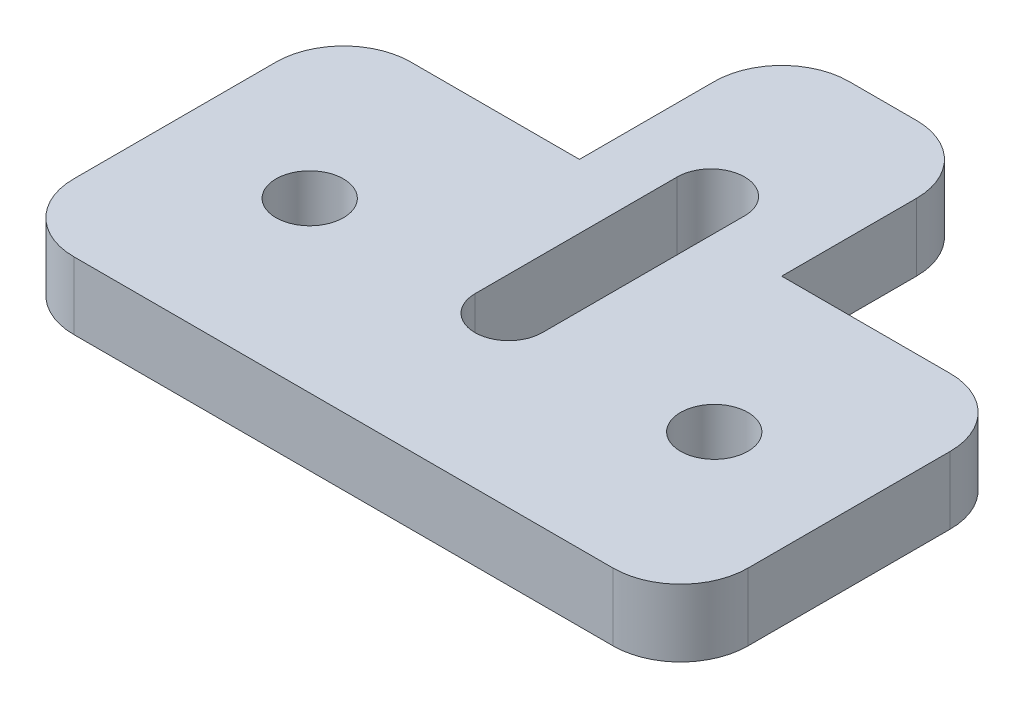
ISO-10303-21;
HEADER;
FILE_DESCRIPTION(('STEP AP214'),'2;1');
FILE_NAME('part.step','',(''),(''),'','','');
FILE_SCHEMA(('AUTOMOTIVE_DESIGN { 1 0 10303 214 1 1 1 1 }'));
ENDSEC;
DATA;
#1=APPLICATION_CONTEXT('core data for automotive mechanical design processes');
#2=APPLICATION_PROTOCOL_DEFINITION('international standard','automotive_design',2000,#1);
#3=PRODUCT_CONTEXT('',#1,'mechanical');
#4=PRODUCT('Part','Part','',(#3));
#5=PRODUCT_RELATED_PRODUCT_CATEGORY('part','',(#4));
#6=PRODUCT_DEFINITION_FORMATION('','',#4);
#7=PRODUCT_DEFINITION_CONTEXT('part definition',#1,'design');
#8=PRODUCT_DEFINITION('design','',#6,#7);
#9=PRODUCT_DEFINITION_SHAPE('','',#8);
#10=(LENGTH_UNIT() NAMED_UNIT(*) SI_UNIT(.MILLI.,.METRE.));
#11=(NAMED_UNIT(*) PLANE_ANGLE_UNIT() SI_UNIT($,.RADIAN.));
#12=(NAMED_UNIT(*) SI_UNIT($,.STERADIAN.) SOLID_ANGLE_UNIT());
#13=UNCERTAINTY_MEASURE_WITH_UNIT(LENGTH_MEASURE(1.E-05),#10,'distance_accuracy_value','');
#14=(GEOMETRIC_REPRESENTATION_CONTEXT(3) GLOBAL_UNCERTAINTY_ASSIGNED_CONTEXT((#13)) GLOBAL_UNIT_ASSIGNED_CONTEXT((#10,
#11,#12)) REPRESENTATION_CONTEXT('',''));
#15=CARTESIAN_POINT('',(0.,0.,0.));
#16=DIRECTION('',(0.,0.,1.));
#17=DIRECTION('',(1.,0.,0.));
#18=AXIS2_PLACEMENT_3D('',#15,#16,#17);
#19=CARTESIAN_POINT('',(-130.,10.,-50.));
#20=DIRECTION('',(0.,0.,1.));
#21=DIRECTION('',(1.,0.,0.));
#22=AXIS2_PLACEMENT_3D('',#19,#20,#21);
#23=PLANE('',#22);
#24=DIRECTION('',(-1.,0.,0.));
#25=VECTOR('',#24,1.);
#26=CARTESIAN_POINT('',(-130.,0.,-50.));
#27=LINE('',#26,#25);
#28=CARTESIAN_POINT('',(-80.,0.,-50.));
#29=VERTEX_POINT('',#28);
#30=CARTESIAN_POINT('',(-105.,0.,-50.));
#31=VERTEX_POINT('',#30);
#32=EDGE_CURVE('E223',#29,#31,#27,.T.);
#33=ORIENTED_EDGE('',*,*,#32,.T.);
#34=DIRECTION('',(0.,1.,0.));
#35=VECTOR('',#34,1.);
#36=CARTESIAN_POINT('',(-105.,10.,-50.));
#37=LINE('',#36,#35);
#38=CARTESIAN_POINT('',(-105.,10.,-50.));
#39=VERTEX_POINT('',#38);
#40=EDGE_CURVE('E277',#31,#39,#37,.T.);
#41=ORIENTED_EDGE('',*,*,#40,.T.);
#42=DIRECTION('',(-1.,0.,0.));
#43=VECTOR('',#42,1.);
#44=CARTESIAN_POINT('',(-130.,10.,-50.));
#45=LINE('',#44,#43);
#46=CARTESIAN_POINT('',(-80.,10.,-50.));
#47=VERTEX_POINT('',#46);
#48=EDGE_CURVE('E208',#47,#39,#45,.T.);
#49=ORIENTED_EDGE('',*,*,#48,.F.);
#50=DIRECTION('',(0.,-1.,0.));
#51=VECTOR('',#50,1.);
#52=CARTESIAN_POINT('',(-80.,10.,-50.));
#53=LINE('',#52,#51);
#54=EDGE_CURVE('E213',#47,#29,#53,.T.);
#55=ORIENTED_EDGE('',*,*,#54,.T.);
#56=EDGE_LOOP('',(#33,#41,#49,#55));
#57=FACE_BOUND('',#56,.T.);
#58=ADVANCED_FACE('F33',(#57),#23,.F.);
#59=CARTESIAN_POINT('',(0.,10.,0.));
#60=DIRECTION('',(0.,0.,-1.));
#61=DIRECTION('',(-1.,0.,0.));
#62=AXIS2_PLACEMENT_3D('',#59,#60,#61);
#63=PLANE('',#62);
#64=DIRECTION('',(1.,0.,0.));
#65=VECTOR('',#64,1.);
#66=CARTESIAN_POINT('',(0.,10.,0.));
#67=LINE('',#66,#65);
#68=CARTESIAN_POINT('',(-105.,10.,0.));
#69=VERTEX_POINT('',#68);
#70=CARTESIAN_POINT('',(-25.,10.,0.));
#71=VERTEX_POINT('',#70);
#72=EDGE_CURVE('E211',#69,#71,#67,.T.);
#73=ORIENTED_EDGE('',*,*,#72,.F.);
#74=DIRECTION('',(0.,1.,0.));
#75=VECTOR('',#74,1.);
#76=CARTESIAN_POINT('',(-105.,0.,0.));
#77=LINE('',#76,#75);
#78=CARTESIAN_POINT('',(-105.,0.,0.));
#79=VERTEX_POINT('',#78);
#80=EDGE_CURVE('E41',#69,#79,#77,.F.);
#81=ORIENTED_EDGE('',*,*,#80,.T.);
#82=DIRECTION('',(1.,0.,0.));
#83=VECTOR('',#82,1.);
#84=CARTESIAN_POINT('',(0.,0.,0.));
#85=LINE('',#84,#83);
#86=CARTESIAN_POINT('',(-25.,0.,0.));
#87=VERTEX_POINT('',#86);
#88=EDGE_CURVE('E201',#79,#87,#85,.T.);
#89=ORIENTED_EDGE('',*,*,#88,.T.);
#90=DIRECTION('',(0.,1.,0.));
#91=VECTOR('',#90,1.);
#92=CARTESIAN_POINT('',(-25.,10.,0.));
#93=LINE('',#92,#91);
#94=EDGE_CURVE('E286',#87,#71,#93,.T.);
#95=ORIENTED_EDGE('',*,*,#94,.T.);
#96=EDGE_LOOP('',(#73,#81,#89,#95));
#97=FACE_BOUND('',#96,.T.);
#98=ADVANCED_FACE('F373',(#97),#63,.F.);
#99=CARTESIAN_POINT('',(0.,10.,0.));
#100=DIRECTION('',(0.,1.,0.));
#101=DIRECTION('',(0.,0.,1.));
#102=AXIS2_PLACEMENT_3D('',#99,#100,#101);
#103=PLANE('',#102);
#104=DIRECTION('',(0.,0.,1.));
#105=VECTOR('',#104,1.);
#106=CARTESIAN_POINT('',(-115.,10.,0.));
#107=LINE('',#106,#105);
#108=CARTESIAN_POINT('',(-115.,10.,-40.));
#109=VERTEX_POINT('',#108);
#110=CARTESIAN_POINT('',(-115.,10.,-9.99999999999999));
#111=VERTEX_POINT('',#110);
#112=EDGE_CURVE('E303',#109,#111,#107,.T.);
#113=ORIENTED_EDGE('',*,*,#112,.T.);
#114=CARTESIAN_POINT('',(-105.,10.,-9.99999999999999));
#115=DIRECTION('',(0.,1.,0.));
#116=DIRECTION('',(0.,0.,1.));
#117=AXIS2_PLACEMENT_3D('',#114,#115,#116);
#118=CIRCLE('',#117,10.);
#119=EDGE_CURVE('E55',#111,#69,#118,.T.);
#120=ORIENTED_EDGE('',*,*,#119,.T.);
#121=ORIENTED_EDGE('',*,*,#72,.T.);
#122=CARTESIAN_POINT('',(-25.,10.,-10.));
#123=DIRECTION('',(0.,1.,0.));
#124=DIRECTION('',(0.,0.,1.));
#125=AXIS2_PLACEMENT_3D('',#122,#123,#124);
#126=CIRCLE('',#125,10.);
#127=CARTESIAN_POINT('',(-15.,10.,-9.99999999999999));
#128=VERTEX_POINT('',#127);
#129=EDGE_CURVE('E289',#71,#128,#126,.T.);
#130=ORIENTED_EDGE('',*,*,#129,.T.);
#131=DIRECTION('',(0.,0.,1.));
#132=VECTOR('',#131,1.);
#133=CARTESIAN_POINT('',(-15.,10.,0.));
#134=LINE('',#133,#132);
#135=CARTESIAN_POINT('',(-15.,10.,-40.));
#136=VERTEX_POINT('',#135);
#137=EDGE_CURVE('E312',#136,#128,#134,.T.);
#138=ORIENTED_EDGE('',*,*,#137,.F.);
#139=CARTESIAN_POINT('',(-25.,10.,-40.));
#140=DIRECTION('',(0.,1.,0.));
#141=DIRECTION('',(0.,0.,1.));
#142=AXIS2_PLACEMENT_3D('',#139,#140,#141);
#143=CIRCLE('',#142,10.);
#144=CARTESIAN_POINT('',(-25.,10.,-50.));
#145=VERTEX_POINT('',#144);
#146=EDGE_CURVE('E271',#136,#145,#143,.T.);
#147=ORIENTED_EDGE('',*,*,#146,.T.);
#148=DIRECTION('',(-1.,0.,0.));
#149=VECTOR('',#148,1.);
#150=CARTESIAN_POINT('',(0.,10.,-50.));
#151=LINE('',#150,#149);
#152=CARTESIAN_POINT('',(-50.,10.,-50.));
#153=VERTEX_POINT('',#152);
#154=EDGE_CURVE('E198',#145,#153,#151,.T.);
#155=ORIENTED_EDGE('',*,*,#154,.T.);
#156=DIRECTION('',(0.,0.,-1.));
#157=VECTOR('',#156,1.);
#158=CARTESIAN_POINT('',(-50.,10.,-50.));
#159=LINE('',#158,#157);
#160=CARTESIAN_POINT('',(-50.,10.,-70.));
#161=VERTEX_POINT('',#160);
#162=EDGE_CURVE('E200',#153,#161,#159,.T.);
#163=ORIENTED_EDGE('',*,*,#162,.T.);
#164=CARTESIAN_POINT('',(-60.,10.,-70.));
#165=DIRECTION('',(0.,1.,0.));
#166=DIRECTION('',(0.,0.,1.));
#167=AXIS2_PLACEMENT_3D('',#164,#165,#166);
#168=CIRCLE('',#167,10.);
#169=CARTESIAN_POINT('',(-60.,10.,-80.));
#170=VERTEX_POINT('',#169);
#171=EDGE_CURVE('E254',#161,#170,#168,.T.);
#172=ORIENTED_EDGE('',*,*,#171,.T.);
#173=DIRECTION('',(-1.,0.,0.));
#174=VECTOR('',#173,1.);
#175=CARTESIAN_POINT('',(-50.,10.,-80.));
#176=LINE('',#175,#174);
#177=CARTESIAN_POINT('',(-70.,10.,-80.));
#178=VERTEX_POINT('',#177);
#179=EDGE_CURVE('E204',#170,#178,#176,.T.);
#180=ORIENTED_EDGE('',*,*,#179,.T.);
#181=CARTESIAN_POINT('',(-70.,10.,-70.));
#182=DIRECTION('',(0.,1.,0.));
#183=DIRECTION('',(0.,0.,1.));
#184=AXIS2_PLACEMENT_3D('',#181,#182,#183);
#185=CIRCLE('',#184,10.);
#186=CARTESIAN_POINT('',(-80.,10.,-70.));
#187=VERTEX_POINT('',#186);
#188=EDGE_CURVE('E245',#178,#187,#185,.T.);
#189=ORIENTED_EDGE('',*,*,#188,.T.);
#190=DIRECTION('',(0.,0.,1.));
#191=VECTOR('',#190,1.);
#192=CARTESIAN_POINT('',(-80.,10.,-80.));
#193=LINE('',#192,#191);
#194=EDGE_CURVE('E206',#187,#47,#193,.T.);
#195=ORIENTED_EDGE('',*,*,#194,.T.);
#196=ORIENTED_EDGE('',*,*,#48,.T.);
#197=CARTESIAN_POINT('',(-105.,10.,-40.));
#198=DIRECTION('',(0.,1.,0.));
#199=DIRECTION('',(0.,0.,1.));
#200=AXIS2_PLACEMENT_3D('',#197,#198,#199);
#201=CIRCLE('',#200,10.);
#202=EDGE_CURVE('E280',#39,#109,#201,.T.);
#203=ORIENTED_EDGE('',*,*,#202,.T.);
#204=EDGE_LOOP('',(#113,#120,#121,#130,#138,#147,#155,#163,#172,#180,#189,#195,#196,#203));
#205=FACE_BOUND('',#204,.T.);
#206=CARTESIAN_POINT('',(-95.,10.,-25.));
#207=DIRECTION('',(0.,1.,0.));
#208=DIRECTION('',(0.,0.,1.));
#209=AXIS2_PLACEMENT_3D('',#206,#207,#208);
#210=CIRCLE('',#209,5.);
#211=CARTESIAN_POINT('',(-95.,10.,-20.));
#212=VERTEX_POINT('',#211);
#213=EDGE_CURVE('E194',#212,#212,#210,.T.);
#214=ORIENTED_EDGE('',*,*,#213,.F.);
#215=EDGE_LOOP('',(#214));
#216=FACE_BOUND('',#215,.T.);
#217=CARTESIAN_POINT('',(-35.,10.,-25.));
#218=DIRECTION('',(0.,1.,0.));
#219=DIRECTION('',(0.,0.,1.));
#220=AXIS2_PLACEMENT_3D('',#217,#218,#219);
#221=CIRCLE('',#220,5.);
#222=CARTESIAN_POINT('',(-35.,10.,-20.));
#223=VERTEX_POINT('',#222);
#224=EDGE_CURVE('E188',#223,#223,#221,.T.);
#225=ORIENTED_EDGE('',*,*,#224,.F.);
#226=EDGE_LOOP('',(#225));
#227=FACE_BOUND('',#226,.T.);
#228=CARTESIAN_POINT('',(-65.4932615227861,10.,-55.));
#229=DIRECTION('',(0.,1.,0.));
#230=DIRECTION('',(0.,0.,1.));
#231=AXIS2_PLACEMENT_3D('',#228,#229,#230);
#232=CIRCLE('',#231,4.99999999999999);
#233=CARTESIAN_POINT('',(-60.4932615227861,10.,-55.));
#234=VERTEX_POINT('',#233);
#235=CARTESIAN_POINT('',(-70.4932615227861,10.,-55.));
#236=VERTEX_POINT('',#235);
#237=EDGE_CURVE('E177',#234,#236,#232,.T.);
#238=ORIENTED_EDGE('',*,*,#237,.F.);
#239=DIRECTION('',(0.,0.,-1.));
#240=VECTOR('',#239,1.);
#241=CARTESIAN_POINT('',(-60.4932615227861,10.,-55.));
#242=LINE('',#241,#240);
#243=CARTESIAN_POINT('',(-60.4932615227861,10.,-25.));
#244=VERTEX_POINT('',#243);
#245=EDGE_CURVE('E181',#244,#234,#242,.T.);
#246=ORIENTED_EDGE('',*,*,#245,.F.);
#247=CARTESIAN_POINT('',(-65.4932615227861,10.,-25.));
#248=DIRECTION('',(0.,1.,0.));
#249=DIRECTION('',(0.,0.,1.));
#250=AXIS2_PLACEMENT_3D('',#247,#248,#249);
#251=CIRCLE('',#250,4.99999999999999);
#252=CARTESIAN_POINT('',(-70.4932615227861,10.,-25.));
#253=VERTEX_POINT('',#252);
#254=EDGE_CURVE('E161',#253,#244,#251,.T.);
#255=ORIENTED_EDGE('',*,*,#254,.F.);
#256=DIRECTION('',(0.,0.,1.));
#257=VECTOR('',#256,1.);
#258=CARTESIAN_POINT('',(-70.4932615227861,10.,-55.));
#259=LINE('',#258,#257);
#260=EDGE_CURVE('E172',#236,#253,#259,.T.);
#261=ORIENTED_EDGE('',*,*,#260,.F.);
#262=EDGE_LOOP('',(#238,#246,#255,#261));
#263=FACE_BOUND('',#262,.T.);
#264=ADVANCED_FACE('F179',(#205,#216,#227,#263),#103,.T.);
#265=CARTESIAN_POINT('',(0.,0.,0.));
#266=DIRECTION('',(0.,1.,0.));
#267=DIRECTION('',(0.,0.,1.));
#268=AXIS2_PLACEMENT_3D('',#265,#266,#267);
#269=PLANE('',#268);
#270=CARTESIAN_POINT('',(-95.,0.,-25.));
#271=DIRECTION('',(0.,1.,0.));
#272=DIRECTION('',(0.,0.,1.));
#273=AXIS2_PLACEMENT_3D('',#270,#271,#272);
#274=CIRCLE('',#273,5.);
#275=CARTESIAN_POINT('',(-95.,0.,-20.));
#276=VERTEX_POINT('',#275);
#277=EDGE_CURVE('E197',#276,#276,#274,.T.);
#278=ORIENTED_EDGE('',*,*,#277,.T.);
#279=EDGE_LOOP('',(#278));
#280=FACE_BOUND('',#279,.T.);
#281=CARTESIAN_POINT('',(-35.,0.,-25.));
#282=DIRECTION('',(0.,1.,0.));
#283=DIRECTION('',(0.,0.,1.));
#284=AXIS2_PLACEMENT_3D('',#281,#282,#283);
#285=CIRCLE('',#284,5.);
#286=CARTESIAN_POINT('',(-35.,0.,-20.));
#287=VERTEX_POINT('',#286);
#288=EDGE_CURVE('E193',#287,#287,#285,.T.);
#289=ORIENTED_EDGE('',*,*,#288,.T.);
#290=EDGE_LOOP('',(#289));
#291=FACE_BOUND('',#290,.T.);
#292=DIRECTION('',(0.,0.,-1.));
#293=VECTOR('',#292,1.);
#294=CARTESIAN_POINT('',(-60.4932615227861,0.,0.));
#295=LINE('',#294,#293);
#296=CARTESIAN_POINT('',(-60.4932615227861,0.,-25.));
#297=VERTEX_POINT('',#296);
#298=CARTESIAN_POINT('',(-60.4932615227861,0.,-55.));
#299=VERTEX_POINT('',#298);
#300=EDGE_CURVE('E259',#297,#299,#295,.T.);
#301=ORIENTED_EDGE('',*,*,#300,.T.);
#302=CARTESIAN_POINT('',(-65.4932615227861,0.,-55.));
#303=DIRECTION('',(0.,1.,0.));
#304=DIRECTION('',(0.,0.,1.));
#305=AXIS2_PLACEMENT_3D('',#302,#303,#304);
#306=CIRCLE('',#305,4.99999999999999);
#307=CARTESIAN_POINT('',(-70.4932615227861,0.,-55.));
#308=VERTEX_POINT('',#307);
#309=EDGE_CURVE('E262',#299,#308,#306,.T.);
#310=ORIENTED_EDGE('',*,*,#309,.T.);
#311=DIRECTION('',(0.,0.,1.));
#312=VECTOR('',#311,1.);
#313=CARTESIAN_POINT('',(-70.4932615227861,0.,0.));
#314=LINE('',#313,#312);
#315=CARTESIAN_POINT('',(-70.4932615227861,0.,-25.));
#316=VERTEX_POINT('',#315);
#317=EDGE_CURVE('E256',#308,#316,#314,.T.);
#318=ORIENTED_EDGE('',*,*,#317,.T.);
#319=CARTESIAN_POINT('',(-65.4932615227861,0.,-25.));
#320=DIRECTION('',(0.,1.,0.));
#321=DIRECTION('',(0.,0.,1.));
#322=AXIS2_PLACEMENT_3D('',#319,#320,#321);
#323=CIRCLE('',#322,4.99999999999999);
#324=EDGE_CURVE('E164',#316,#297,#323,.T.);
#325=ORIENTED_EDGE('',*,*,#324,.T.);
#326=EDGE_LOOP('',(#301,#310,#318,#325));
#327=FACE_BOUND('',#326,.T.);
#328=ORIENTED_EDGE('',*,*,#88,.F.);
#329=CARTESIAN_POINT('',(-105.,0.,-9.99999999999999));
#330=DIRECTION('',(0.,1.,0.));
#331=DIRECTION('',(0.,0.,1.));
#332=AXIS2_PLACEMENT_3D('',#329,#330,#331);
#333=CIRCLE('',#332,10.);
#334=CARTESIAN_POINT('',(-115.,0.,-9.99999999999999));
#335=VERTEX_POINT('',#334);
#336=EDGE_CURVE('E11',#79,#335,#333,.F.);
#337=ORIENTED_EDGE('',*,*,#336,.T.);
#338=DIRECTION('',(0.,0.,1.));
#339=VECTOR('',#338,1.);
#340=CARTESIAN_POINT('',(-115.,0.,0.));
#341=LINE('',#340,#339);
#342=CARTESIAN_POINT('',(-115.,0.,-40.));
#343=VERTEX_POINT('',#342);
#344=EDGE_CURVE('E265',#343,#335,#341,.T.);
#345=ORIENTED_EDGE('',*,*,#344,.F.);
#346=CARTESIAN_POINT('',(-105.,0.,-40.));
#347=DIRECTION('',(0.,1.,0.));
#348=DIRECTION('',(0.,0.,1.));
#349=AXIS2_PLACEMENT_3D('',#346,#347,#348);
#350=CIRCLE('',#349,10.);
#351=EDGE_CURVE('E284',#343,#31,#350,.F.);
#352=ORIENTED_EDGE('',*,*,#351,.T.);
#353=ORIENTED_EDGE('',*,*,#32,.F.);
#354=DIRECTION('',(0.,0.,1.));
#355=VECTOR('',#354,1.);
#356=CARTESIAN_POINT('',(-80.,0.,-80.));
#357=LINE('',#356,#355);
#358=CARTESIAN_POINT('',(-80.,0.,-70.));
#359=VERTEX_POINT('',#358);
#360=EDGE_CURVE('E221',#359,#29,#357,.T.);
#361=ORIENTED_EDGE('',*,*,#360,.F.);
#362=CARTESIAN_POINT('',(-70.,0.,-70.));
#363=DIRECTION('',(0.,1.,0.));
#364=DIRECTION('',(0.,0.,1.));
#365=AXIS2_PLACEMENT_3D('',#362,#363,#364);
#366=CIRCLE('',#365,10.);
#367=CARTESIAN_POINT('',(-70.,0.,-80.));
#368=VERTEX_POINT('',#367);
#369=EDGE_CURVE('E239',#359,#368,#366,.F.);
#370=ORIENTED_EDGE('',*,*,#369,.T.);
#371=DIRECTION('',(-1.,0.,0.));
#372=VECTOR('',#371,1.);
#373=CARTESIAN_POINT('',(-50.,0.,-80.));
#374=LINE('',#373,#372);
#375=CARTESIAN_POINT('',(-60.,0.,-80.));
#376=VERTEX_POINT('',#375);
#377=EDGE_CURVE('E219',#376,#368,#374,.T.);
#378=ORIENTED_EDGE('',*,*,#377,.F.);
#379=CARTESIAN_POINT('',(-60.,0.,-70.));
#380=DIRECTION('',(0.,1.,0.));
#381=DIRECTION('',(0.,0.,1.));
#382=AXIS2_PLACEMENT_3D('',#379,#380,#381);
#383=CIRCLE('',#382,10.);
#384=CARTESIAN_POINT('',(-50.,0.,-70.));
#385=VERTEX_POINT('',#384);
#386=EDGE_CURVE('E250',#376,#385,#383,.F.);
#387=ORIENTED_EDGE('',*,*,#386,.T.);
#388=DIRECTION('',(0.,0.,-1.));
#389=VECTOR('',#388,1.);
#390=CARTESIAN_POINT('',(-50.,0.,-50.));
#391=LINE('',#390,#389);
#392=CARTESIAN_POINT('',(-50.,0.,-50.));
#393=VERTEX_POINT('',#392);
#394=EDGE_CURVE('E216',#393,#385,#391,.T.);
#395=ORIENTED_EDGE('',*,*,#394,.F.);
#396=DIRECTION('',(-1.,0.,0.));
#397=VECTOR('',#396,1.);
#398=CARTESIAN_POINT('',(0.,0.,-50.));
#399=LINE('',#398,#397);
#400=CARTESIAN_POINT('',(-25.,0.,-50.));
#401=VERTEX_POINT('',#400);
#402=EDGE_CURVE('E214',#401,#393,#399,.T.);
#403=ORIENTED_EDGE('',*,*,#402,.F.);
#404=CARTESIAN_POINT('',(-25.,0.,-40.));
#405=DIRECTION('',(0.,1.,0.));
#406=DIRECTION('',(0.,0.,1.));
#407=AXIS2_PLACEMENT_3D('',#404,#405,#406);
#408=CIRCLE('',#407,10.);
#409=CARTESIAN_POINT('',(-15.,0.,-40.));
#410=VERTEX_POINT('',#409);
#411=EDGE_CURVE('E275',#401,#410,#408,.F.);
#412=ORIENTED_EDGE('',*,*,#411,.T.);
#413=DIRECTION('',(0.,0.,1.));
#414=VECTOR('',#413,1.);
#415=CARTESIAN_POINT('',(-15.,0.,0.));
#416=LINE('',#415,#414);
#417=CARTESIAN_POINT('',(-15.,0.,-9.99999999999999));
#418=VERTEX_POINT('',#417);
#419=EDGE_CURVE('E309',#410,#418,#416,.T.);
#420=ORIENTED_EDGE('',*,*,#419,.T.);
#421=CARTESIAN_POINT('',(-25.,0.,-10.));
#422=DIRECTION('',(0.,1.,0.));
#423=DIRECTION('',(0.,0.,1.));
#424=AXIS2_PLACEMENT_3D('',#421,#422,#423);
#425=CIRCLE('',#424,10.);
#426=EDGE_CURVE('E293',#418,#87,#425,.F.);
#427=ORIENTED_EDGE('',*,*,#426,.T.);
#428=EDGE_LOOP('',(#328,#337,#345,#352,#353,#361,#370,#378,#387,#395,#403,#412,#420,#427));
#429=FACE_BOUND('',#428,.T.);
#430=ADVANCED_FACE('F328',(#280,#291,#327,#429),#269,.F.);
#431=CARTESIAN_POINT('',(0.,10.,-50.));
#432=DIRECTION('',(0.,0.,1.));
#433=DIRECTION('',(1.,0.,0.));
#434=AXIS2_PLACEMENT_3D('',#431,#432,#433);
#435=PLANE('',#434);
#436=ORIENTED_EDGE('',*,*,#154,.F.);
#437=DIRECTION('',(0.,1.,0.));
#438=VECTOR('',#437,1.);
#439=CARTESIAN_POINT('',(-25.,10.,-50.));
#440=LINE('',#439,#438);
#441=EDGE_CURVE('E273',#145,#401,#440,.F.);
#442=ORIENTED_EDGE('',*,*,#441,.T.);
#443=ORIENTED_EDGE('',*,*,#402,.T.);
#444=DIRECTION('',(0.,-1.,0.));
#445=VECTOR('',#444,1.);
#446=CARTESIAN_POINT('',(-50.,10.,-50.));
#447=LINE('',#446,#445);
#448=EDGE_CURVE('E229',#153,#393,#447,.T.);
#449=ORIENTED_EDGE('',*,*,#448,.F.);
#450=EDGE_LOOP('',(#436,#442,#443,#449));
#451=FACE_BOUND('',#450,.T.);
#452=ADVANCED_FACE('F337',(#451),#435,.F.);
#453=CARTESIAN_POINT('',(-50.,10.,-50.));
#454=DIRECTION('',(-1.,0.,0.));
#455=DIRECTION('',(0.,0.,1.));
#456=AXIS2_PLACEMENT_3D('',#453,#454,#455);
#457=PLANE('',#456);
#458=ORIENTED_EDGE('',*,*,#394,.T.);
#459=DIRECTION('',(0.,-1.,0.));
#460=VECTOR('',#459,1.);
#461=CARTESIAN_POINT('',(-50.,10.,-70.));
#462=LINE('',#461,#460);
#463=EDGE_CURVE('E252',#385,#161,#462,.F.);
#464=ORIENTED_EDGE('',*,*,#463,.T.);
#465=ORIENTED_EDGE('',*,*,#162,.F.);
#466=ORIENTED_EDGE('',*,*,#448,.T.);
#467=EDGE_LOOP('',(#458,#464,#465,#466));
#468=FACE_BOUND('',#467,.T.);
#469=ADVANCED_FACE('F341',(#468),#457,.F.);
#470=CARTESIAN_POINT('',(-50.,10.,-80.));
#471=DIRECTION('',(0.,0.,1.));
#472=DIRECTION('',(1.,0.,0.));
#473=AXIS2_PLACEMENT_3D('',#470,#471,#472);
#474=PLANE('',#473);
#475=ORIENTED_EDGE('',*,*,#179,.F.);
#476=DIRECTION('',(0.,-1.,0.));
#477=VECTOR('',#476,1.);
#478=CARTESIAN_POINT('',(-60.,10.,-80.));
#479=LINE('',#478,#477);
#480=EDGE_CURVE('E247',#170,#376,#479,.T.);
#481=ORIENTED_EDGE('',*,*,#480,.T.);
#482=ORIENTED_EDGE('',*,*,#377,.T.);
#483=DIRECTION('',(0.,-1.,0.));
#484=VECTOR('',#483,1.);
#485=CARTESIAN_POINT('',(-70.,10.,-80.));
#486=LINE('',#485,#484);
#487=EDGE_CURVE('E242',#368,#178,#486,.F.);
#488=ORIENTED_EDGE('',*,*,#487,.T.);
#489=EDGE_LOOP('',(#475,#481,#482,#488));
#490=FACE_BOUND('',#489,.T.);
#491=ADVANCED_FACE('F350',(#490),#474,.F.);
#492=CARTESIAN_POINT('',(-80.,10.,-80.));
#493=DIRECTION('',(1.,0.,0.));
#494=DIRECTION('',(0.,0.,-1.));
#495=AXIS2_PLACEMENT_3D('',#492,#493,#494);
#496=PLANE('',#495);
#497=ORIENTED_EDGE('',*,*,#194,.F.);
#498=DIRECTION('',(0.,-1.,0.));
#499=VECTOR('',#498,1.);
#500=CARTESIAN_POINT('',(-80.,10.,-70.));
#501=LINE('',#500,#499);
#502=EDGE_CURVE('E232',#187,#359,#501,.T.);
#503=ORIENTED_EDGE('',*,*,#502,.T.);
#504=ORIENTED_EDGE('',*,*,#360,.T.);
#505=ORIENTED_EDGE('',*,*,#54,.F.);
#506=EDGE_LOOP('',(#497,#503,#504,#505));
#507=FACE_BOUND('',#506,.T.);
#508=ADVANCED_FACE('F361',(#507),#496,.F.);
#509=CARTESIAN_POINT('',(-95.,-16.,-25.));
#510=DIRECTION('',(0.,1.,0.));
#511=DIRECTION('',(0.,0.,1.));
#512=AXIS2_PLACEMENT_3D('',#509,#510,#511);
#513=CYLINDRICAL_SURFACE('',#512,5.);
#514=ORIENTED_EDGE('',*,*,#213,.T.);
#515=EDGE_LOOP('',(#514));
#516=FACE_BOUND('',#515,.T.);
#517=ORIENTED_EDGE('',*,*,#277,.F.);
#518=EDGE_LOOP('',(#517));
#519=FACE_BOUND('',#518,.T.);
#520=ADVANCED_FACE('F383',(#516,#519),#513,.F.);
#521=CARTESIAN_POINT('',(-35.,-16.,-25.));
#522=DIRECTION('',(0.,1.,0.));
#523=DIRECTION('',(0.,0.,1.));
#524=AXIS2_PLACEMENT_3D('',#521,#522,#523);
#525=CYLINDRICAL_SURFACE('',#524,5.);
#526=ORIENTED_EDGE('',*,*,#224,.T.);
#527=EDGE_LOOP('',(#526));
#528=FACE_BOUND('',#527,.T.);
#529=ORIENTED_EDGE('',*,*,#288,.F.);
#530=EDGE_LOOP('',(#529));
#531=FACE_BOUND('',#530,.T.);
#532=ADVANCED_FACE('F392',(#528,#531),#525,.F.);
#533=CARTESIAN_POINT('',(-70.,10.,-70.));
#534=DIRECTION('',(0.,-1.,0.));
#535=DIRECTION('',(0.,0.,-1.));
#536=AXIS2_PLACEMENT_3D('',#533,#534,#535);
#537=CYLINDRICAL_SURFACE('',#536,10.);
#538=ORIENTED_EDGE('',*,*,#188,.F.);
#539=ORIENTED_EDGE('',*,*,#487,.F.);
#540=ORIENTED_EDGE('',*,*,#369,.F.);
#541=ORIENTED_EDGE('',*,*,#502,.F.);
#542=EDGE_LOOP('',(#538,#539,#540,#541));
#543=FACE_BOUND('',#542,.T.);
#544=ADVANCED_FACE('F357',(#543),#537,.T.);
#545=CARTESIAN_POINT('',(-60.,10.,-70.));
#546=DIRECTION('',(0.,-1.,0.));
#547=DIRECTION('',(0.,0.,-1.));
#548=AXIS2_PLACEMENT_3D('',#545,#546,#547);
#549=CYLINDRICAL_SURFACE('',#548,10.);
#550=ORIENTED_EDGE('',*,*,#171,.F.);
#551=ORIENTED_EDGE('',*,*,#463,.F.);
#552=ORIENTED_EDGE('',*,*,#386,.F.);
#553=ORIENTED_EDGE('',*,*,#480,.F.);
#554=EDGE_LOOP('',(#550,#551,#552,#553));
#555=FACE_BOUND('',#554,.T.);
#556=ADVANCED_FACE('F347',(#555),#549,.T.);
#557=CARTESIAN_POINT('',(-65.4932615227861,-16.,-55.));
#558=DIRECTION('',(0.,1.,0.));
#559=DIRECTION('',(0.,0.,1.));
#560=AXIS2_PLACEMENT_3D('',#557,#558,#559);
#561=CYLINDRICAL_SURFACE('',#560,4.99999999999999);
#562=DIRECTION('',(0.,1.,0.));
#563=VECTOR('',#562,1.);
#564=CARTESIAN_POINT('',(-60.4932615227861,-16.,-55.));
#565=LINE('',#564,#563);
#566=EDGE_CURVE('E186',#299,#234,#565,.T.);
#567=ORIENTED_EDGE('',*,*,#566,.T.);
#568=ORIENTED_EDGE('',*,*,#237,.T.);
#569=DIRECTION('',(0.,1.,0.));
#570=VECTOR('',#569,1.);
#571=CARTESIAN_POINT('',(-70.4932615227861,-16.,-55.));
#572=LINE('',#571,#570);
#573=EDGE_CURVE('E168',#308,#236,#572,.T.);
#574=ORIENTED_EDGE('',*,*,#573,.F.);
#575=ORIENTED_EDGE('',*,*,#309,.F.);
#576=EDGE_LOOP('',(#567,#568,#574,#575));
#577=FACE_BOUND('',#576,.T.);
#578=ADVANCED_FACE('F395',(#577),#561,.F.);
#579=CARTESIAN_POINT('',(-60.4932615227861,-16.,-55.));
#580=DIRECTION('',(1.,0.,0.));
#581=DIRECTION('',(0.,0.,-1.));
#582=AXIS2_PLACEMENT_3D('',#579,#580,#581);
#583=PLANE('',#582);
#584=DIRECTION('',(0.,1.,0.));
#585=VECTOR('',#584,1.);
#586=CARTESIAN_POINT('',(-60.4932615227861,-16.,-25.));
#587=LINE('',#586,#585);
#588=EDGE_CURVE('E167',#297,#244,#587,.T.);
#589=ORIENTED_EDGE('',*,*,#588,.T.);
#590=ORIENTED_EDGE('',*,*,#245,.T.);
#591=ORIENTED_EDGE('',*,*,#566,.F.);
#592=ORIENTED_EDGE('',*,*,#300,.F.);
#593=EDGE_LOOP('',(#589,#590,#591,#592));
#594=FACE_BOUND('',#593,.T.);
#595=ADVANCED_FACE('F460',(#594),#583,.F.);
#596=CARTESIAN_POINT('',(-65.4932615227861,-16.,-25.));
#597=DIRECTION('',(0.,1.,0.));
#598=DIRECTION('',(0.,0.,1.));
#599=AXIS2_PLACEMENT_3D('',#596,#597,#598);
#600=CYLINDRICAL_SURFACE('',#599,4.99999999999999);
#601=DIRECTION('',(0.,1.,0.));
#602=VECTOR('',#601,1.);
#603=CARTESIAN_POINT('',(-70.4932615227861,-16.,-25.));
#604=LINE('',#603,#602);
#605=EDGE_CURVE('E156',#316,#253,#604,.T.);
#606=ORIENTED_EDGE('',*,*,#605,.T.);
#607=ORIENTED_EDGE('',*,*,#254,.T.);
#608=ORIENTED_EDGE('',*,*,#588,.F.);
#609=ORIENTED_EDGE('',*,*,#324,.F.);
#610=EDGE_LOOP('',(#606,#607,#608,#609));
#611=FACE_BOUND('',#610,.T.);
#612=ADVANCED_FACE('F158',(#611),#600,.F.);
#613=CARTESIAN_POINT('',(-70.4932615227861,-16.,-55.));
#614=DIRECTION('',(-1.,0.,0.));
#615=DIRECTION('',(0.,0.,1.));
#616=AXIS2_PLACEMENT_3D('',#613,#614,#615);
#617=PLANE('',#616);
#618=ORIENTED_EDGE('',*,*,#573,.T.);
#619=ORIENTED_EDGE('',*,*,#260,.T.);
#620=ORIENTED_EDGE('',*,*,#605,.F.);
#621=ORIENTED_EDGE('',*,*,#317,.F.);
#622=EDGE_LOOP('',(#618,#619,#620,#621));
#623=FACE_BOUND('',#622,.T.);
#624=ADVANCED_FACE('F173',(#623),#617,.F.);
#625=CARTESIAN_POINT('',(-115.,-21.,0.));
#626=DIRECTION('',(-1.,0.,0.));
#627=DIRECTION('',(0.,0.,1.));
#628=AXIS2_PLACEMENT_3D('',#625,#626,#627);
#629=PLANE('',#628);
#630=ORIENTED_EDGE('',*,*,#344,.T.);
#631=DIRECTION('',(0.,1.,0.));
#632=VECTOR('',#631,1.);
#633=CARTESIAN_POINT('',(-115.,10.,-9.99999999999999));
#634=LINE('',#633,#632);
#635=EDGE_CURVE('E296',#335,#111,#634,.T.);
#636=ORIENTED_EDGE('',*,*,#635,.T.);
#637=ORIENTED_EDGE('',*,*,#112,.F.);
#638=DIRECTION('',(0.,1.,0.));
#639=VECTOR('',#638,1.);
#640=CARTESIAN_POINT('',(-115.,0.,-40.));
#641=LINE('',#640,#639);
#642=EDGE_CURVE('E282',#109,#343,#641,.F.);
#643=ORIENTED_EDGE('',*,*,#642,.T.);
#644=EDGE_LOOP('',(#630,#636,#637,#643));
#645=FACE_BOUND('',#644,.T.);
#646=ADVANCED_FACE('F302',(#645),#629,.T.);
#647=CARTESIAN_POINT('',(-15.,-22.,0.));
#648=DIRECTION('',(-1.,0.,0.));
#649=DIRECTION('',(0.,0.,1.));
#650=AXIS2_PLACEMENT_3D('',#647,#648,#649);
#651=PLANE('',#650);
#652=ORIENTED_EDGE('',*,*,#137,.T.);
#653=DIRECTION('',(0.,1.,0.));
#654=VECTOR('',#653,1.);
#655=CARTESIAN_POINT('',(-15.,-22.,-9.99999999999999));
#656=LINE('',#655,#654);
#657=EDGE_CURVE('E291',#128,#418,#656,.F.);
#658=ORIENTED_EDGE('',*,*,#657,.T.);
#659=ORIENTED_EDGE('',*,*,#419,.F.);
#660=DIRECTION('',(0.,1.,0.));
#661=VECTOR('',#660,1.);
#662=CARTESIAN_POINT('',(-15.,-22.,-40.));
#663=LINE('',#662,#661);
#664=EDGE_CURVE('E268',#410,#136,#663,.T.);
#665=ORIENTED_EDGE('',*,*,#664,.T.);
#666=EDGE_LOOP('',(#652,#658,#659,#665));
#667=FACE_BOUND('',#666,.T.);
#668=ADVANCED_FACE('F319',(#667),#651,.F.);
#669=CARTESIAN_POINT('',(-25.,-22.,-40.));
#670=DIRECTION('',(0.,1.,0.));
#671=DIRECTION('',(0.,0.,1.));
#672=AXIS2_PLACEMENT_3D('',#669,#670,#671);
#673=CYLINDRICAL_SURFACE('',#672,10.);
#674=ORIENTED_EDGE('',*,*,#411,.F.);
#675=ORIENTED_EDGE('',*,*,#441,.F.);
#676=ORIENTED_EDGE('',*,*,#146,.F.);
#677=ORIENTED_EDGE('',*,*,#664,.F.);
#678=EDGE_LOOP('',(#674,#675,#676,#677));
#679=FACE_BOUND('',#678,.T.);
#680=ADVANCED_FACE('F332',(#679),#673,.T.);
#681=CARTESIAN_POINT('',(-105.,10.,-40.));
#682=DIRECTION('',(0.,-1.,0.));
#683=DIRECTION('',(0.,0.,-1.));
#684=AXIS2_PLACEMENT_3D('',#681,#682,#683);
#685=CYLINDRICAL_SURFACE('',#684,10.);
#686=ORIENTED_EDGE('',*,*,#351,.F.);
#687=ORIENTED_EDGE('',*,*,#642,.F.);
#688=ORIENTED_EDGE('',*,*,#202,.F.);
#689=ORIENTED_EDGE('',*,*,#40,.F.);
#690=EDGE_LOOP('',(#686,#687,#688,#689));
#691=FACE_BOUND('',#690,.T.);
#692=ADVANCED_FACE('F367',(#691),#685,.T.);
#693=CARTESIAN_POINT('',(-25.,10.,-10.));
#694=DIRECTION('',(0.,1.,0.));
#695=DIRECTION('',(0.,0.,1.));
#696=AXIS2_PLACEMENT_3D('',#693,#694,#695);
#697=CYLINDRICAL_SURFACE('',#696,10.);
#698=ORIENTED_EDGE('',*,*,#426,.F.);
#699=ORIENTED_EDGE('',*,*,#657,.F.);
#700=ORIENTED_EDGE('',*,*,#129,.F.);
#701=ORIENTED_EDGE('',*,*,#94,.F.);
#702=EDGE_LOOP('',(#698,#699,#700,#701));
#703=FACE_BOUND('',#702,.T.);
#704=ADVANCED_FACE('F325',(#703),#697,.T.);
#705=CARTESIAN_POINT('',(-105.,-21.,-9.99999999999999));
#706=DIRECTION('',(0.,-1.,0.));
#707=DIRECTION('',(0.,0.,-1.));
#708=AXIS2_PLACEMENT_3D('',#705,#706,#707);
#709=CYLINDRICAL_SURFACE('',#708,10.);
#710=ORIENTED_EDGE('',*,*,#336,.F.);
#711=ORIENTED_EDGE('',*,*,#80,.F.);
#712=ORIENTED_EDGE('',*,*,#119,.F.);
#713=ORIENTED_EDGE('',*,*,#635,.F.);
#714=EDGE_LOOP('',(#710,#711,#712,#713));
#715=FACE_BOUND('',#714,.T.);
#716=ADVANCED_FACE('F35',(#715),#709,.T.);
#717=CLOSED_SHELL('',(#58,#98,#264,#430,#452,#469,#491,#508,#520,#532,#544,#556,#578,#595,#612,
#624,#646,#668,#680,#692,#704,#716));
#718=MANIFOLD_SOLID_BREP('B2',#717);
#719=ADVANCED_BREP_SHAPE_REPRESENTATION('',(#18,#718),#14);
#720=SHAPE_DEFINITION_REPRESENTATION(#9,#719);
ENDSEC;
END-ISO-10303-21;
